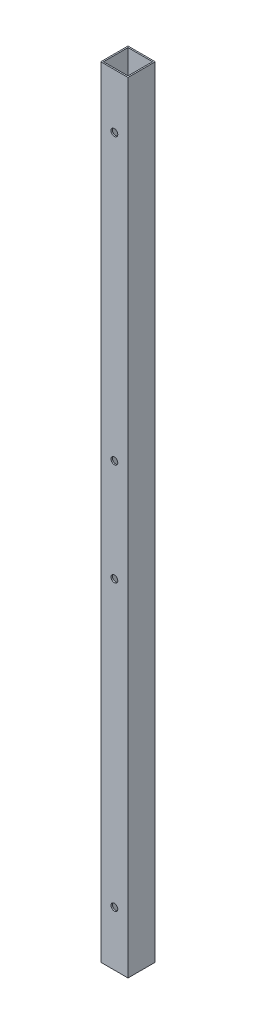
ISO-10303-21;
HEADER;
FILE_DESCRIPTION(('STEP AP214'),'2;1');
FILE_NAME('part.step','',(''),(''),'','','');
FILE_SCHEMA(('AUTOMOTIVE_DESIGN { 1 0 10303 214 1 1 1 1 }'));
ENDSEC;
DATA;
#1=APPLICATION_CONTEXT('core data for automotive mechanical design processes');
#2=APPLICATION_PROTOCOL_DEFINITION('international standard','automotive_design',2000,#1);
#3=PRODUCT_CONTEXT('',#1,'mechanical');
#4=PRODUCT('Part','Part','',(#3));
#5=PRODUCT_RELATED_PRODUCT_CATEGORY('part','',(#4));
#6=PRODUCT_DEFINITION_FORMATION('','',#4);
#7=PRODUCT_DEFINITION_CONTEXT('part definition',#1,'design');
#8=PRODUCT_DEFINITION('design','',#6,#7);
#9=PRODUCT_DEFINITION_SHAPE('','',#8);
#10=(LENGTH_UNIT() NAMED_UNIT(*) SI_UNIT(.MILLI.,.METRE.));
#11=(NAMED_UNIT(*) PLANE_ANGLE_UNIT() SI_UNIT($,.RADIAN.));
#12=(NAMED_UNIT(*) SI_UNIT($,.STERADIAN.) SOLID_ANGLE_UNIT());
#13=UNCERTAINTY_MEASURE_WITH_UNIT(LENGTH_MEASURE(1.E-05),#10,'distance_accuracy_value','');
#14=(GEOMETRIC_REPRESENTATION_CONTEXT(3) GLOBAL_UNCERTAINTY_ASSIGNED_CONTEXT((#13)) GLOBAL_UNIT_ASSIGNED_CONTEXT((#10,
#11,#12)) REPRESENTATION_CONTEXT('',''));
#15=CARTESIAN_POINT('',(0.,0.,0.));
#16=DIRECTION('',(0.,0.,1.));
#17=DIRECTION('',(1.,0.,0.));
#18=AXIS2_PLACEMENT_3D('',#15,#16,#17);
#19=CARTESIAN_POINT('',(0.,1454.15,0.));
#20=DIRECTION('',(0.,1.,0.));
#21=DIRECTION('',(0.,0.,1.));
#22=AXIS2_PLACEMENT_3D('',#19,#20,#21);
#23=PLANE('',#22);
#24=DIRECTION('',(0.,0.,-1.));
#25=VECTOR('',#24,1.);
#26=CARTESIAN_POINT('',(25.4,1454.15,-25.4));
#27=LINE('',#26,#25);
#28=CARTESIAN_POINT('',(25.4,1454.15,25.4));
#29=VERTEX_POINT('',#28);
#30=CARTESIAN_POINT('',(25.4,1454.15,-25.4));
#31=VERTEX_POINT('',#30);
#32=EDGE_CURVE('E163',#29,#31,#27,.T.);
#33=ORIENTED_EDGE('',*,*,#32,.T.);
#34=DIRECTION('',(-1.,0.,0.));
#35=VECTOR('',#34,1.);
#36=CARTESIAN_POINT('',(-25.4,1454.15,-25.4));
#37=LINE('',#36,#35);
#38=CARTESIAN_POINT('',(-25.4,1454.15,-25.4));
#39=VERTEX_POINT('',#38);
#40=EDGE_CURVE('E167',#31,#39,#37,.T.);
#41=ORIENTED_EDGE('',*,*,#40,.T.);
#42=DIRECTION('',(0.,0.,1.));
#43=VECTOR('',#42,1.);
#44=CARTESIAN_POINT('',(-25.4,1454.15,-25.4));
#45=LINE('',#44,#43);
#46=CARTESIAN_POINT('',(-25.4,1454.15,25.4));
#47=VERTEX_POINT('',#46);
#48=EDGE_CURVE('E171',#39,#47,#45,.T.);
#49=ORIENTED_EDGE('',*,*,#48,.T.);
#50=DIRECTION('',(1.,0.,0.));
#51=VECTOR('',#50,1.);
#52=CARTESIAN_POINT('',(-25.4,1454.15,25.4));
#53=LINE('',#52,#51);
#54=EDGE_CURVE('E174',#47,#29,#53,.T.);
#55=ORIENTED_EDGE('',*,*,#54,.T.);
#56=EDGE_LOOP('',(#33,#41,#49,#55));
#57=FACE_BOUND('',#56,.T.);
#58=DIRECTION('',(1.,0.,0.));
#59=VECTOR('',#58,1.);
#60=CARTESIAN_POINT('',(-22.86,1454.15,22.86));
#61=LINE('',#60,#59);
#62=CARTESIAN_POINT('',(-22.86,1454.15,22.86));
#63=VERTEX_POINT('',#62);
#64=CARTESIAN_POINT('',(22.86,1454.15,22.86));
#65=VERTEX_POINT('',#64);
#66=EDGE_CURVE('E121',#63,#65,#61,.T.);
#67=ORIENTED_EDGE('',*,*,#66,.F.);
#68=DIRECTION('',(0.,0.,1.));
#69=VECTOR('',#68,1.);
#70=CARTESIAN_POINT('',(-22.86,1454.15,-22.86));
#71=LINE('',#70,#69);
#72=CARTESIAN_POINT('',(-22.86,1454.15,-22.86));
#73=VERTEX_POINT('',#72);
#74=EDGE_CURVE('E112',#73,#63,#71,.T.);
#75=ORIENTED_EDGE('',*,*,#74,.F.);
#76=DIRECTION('',(-1.,0.,0.));
#77=VECTOR('',#76,1.);
#78=CARTESIAN_POINT('',(-22.86,1454.15,-22.86));
#79=LINE('',#78,#77);
#80=CARTESIAN_POINT('',(22.86,1454.15,-22.86));
#81=VERTEX_POINT('',#80);
#82=EDGE_CURVE('E139',#81,#73,#79,.T.);
#83=ORIENTED_EDGE('',*,*,#82,.F.);
#84=DIRECTION('',(0.,0.,-1.));
#85=VECTOR('',#84,1.);
#86=CARTESIAN_POINT('',(22.86,1454.15,-22.86));
#87=LINE('',#86,#85);
#88=EDGE_CURVE('E134',#65,#81,#87,.T.);
#89=ORIENTED_EDGE('',*,*,#88,.F.);
#90=EDGE_LOOP('',(#67,#75,#83,#89));
#91=FACE_BOUND('',#90,.T.);
#92=ADVANCED_FACE('F44',(#57,#91),#23,.T.);
#93=CARTESIAN_POINT('',(0.,0.,0.));
#94=DIRECTION('',(0.,1.,0.));
#95=DIRECTION('',(0.,0.,1.));
#96=AXIS2_PLACEMENT_3D('',#93,#94,#95);
#97=PLANE('',#96);
#98=DIRECTION('',(0.,0.,-1.));
#99=VECTOR('',#98,1.);
#100=CARTESIAN_POINT('',(25.4,0.,-25.4));
#101=LINE('',#100,#99);
#102=CARTESIAN_POINT('',(25.4,0.,25.4));
#103=VERTEX_POINT('',#102);
#104=CARTESIAN_POINT('',(25.4,0.,-25.4));
#105=VERTEX_POINT('',#104);
#106=EDGE_CURVE('E130',#103,#105,#101,.T.);
#107=ORIENTED_EDGE('',*,*,#106,.F.);
#108=DIRECTION('',(1.,0.,0.));
#109=VECTOR('',#108,1.);
#110=CARTESIAN_POINT('',(-25.4,0.,25.4));
#111=LINE('',#110,#109);
#112=CARTESIAN_POINT('',(-25.4,0.,25.4));
#113=VERTEX_POINT('',#112);
#114=EDGE_CURVE('E168',#113,#103,#111,.T.);
#115=ORIENTED_EDGE('',*,*,#114,.F.);
#116=DIRECTION('',(0.,0.,1.));
#117=VECTOR('',#116,1.);
#118=CARTESIAN_POINT('',(-25.4,0.,-25.4));
#119=LINE('',#118,#117);
#120=CARTESIAN_POINT('',(-25.4,0.,-25.4));
#121=VERTEX_POINT('',#120);
#122=EDGE_CURVE('E184',#121,#113,#119,.T.);
#123=ORIENTED_EDGE('',*,*,#122,.F.);
#124=DIRECTION('',(-1.,0.,0.));
#125=VECTOR('',#124,1.);
#126=CARTESIAN_POINT('',(-25.4,0.,-25.4));
#127=LINE('',#126,#125);
#128=EDGE_CURVE('E181',#105,#121,#127,.T.);
#129=ORIENTED_EDGE('',*,*,#128,.F.);
#130=EDGE_LOOP('',(#107,#115,#123,#129));
#131=FACE_BOUND('',#130,.T.);
#132=DIRECTION('',(0.,0.,1.));
#133=VECTOR('',#132,1.);
#134=CARTESIAN_POINT('',(-22.86,0.,-22.86));
#135=LINE('',#134,#133);
#136=CARTESIAN_POINT('',(-22.86,0.,-22.86));
#137=VERTEX_POINT('',#136);
#138=CARTESIAN_POINT('',(-22.86,0.,22.86));
#139=VERTEX_POINT('',#138);
#140=EDGE_CURVE('E70',#137,#139,#135,.T.);
#141=ORIENTED_EDGE('',*,*,#140,.T.);
#142=DIRECTION('',(1.,0.,0.));
#143=VECTOR('',#142,1.);
#144=CARTESIAN_POINT('',(-22.86,0.,22.86));
#145=LINE('',#144,#143);
#146=CARTESIAN_POINT('',(22.86,0.,22.86));
#147=VERTEX_POINT('',#146);
#148=EDGE_CURVE('E128',#139,#147,#145,.T.);
#149=ORIENTED_EDGE('',*,*,#148,.T.);
#150=DIRECTION('',(0.,0.,-1.));
#151=VECTOR('',#150,1.);
#152=CARTESIAN_POINT('',(22.86,0.,-22.86));
#153=LINE('',#152,#151);
#154=CARTESIAN_POINT('',(22.86,0.,-22.86));
#155=VERTEX_POINT('',#154);
#156=EDGE_CURVE('E150',#147,#155,#153,.T.);
#157=ORIENTED_EDGE('',*,*,#156,.T.);
#158=DIRECTION('',(-1.,0.,0.));
#159=VECTOR('',#158,1.);
#160=CARTESIAN_POINT('',(-22.86,0.,-22.86));
#161=LINE('',#160,#159);
#162=EDGE_CURVE('E122',#155,#137,#161,.T.);
#163=ORIENTED_EDGE('',*,*,#162,.T.);
#164=EDGE_LOOP('',(#141,#149,#157,#163));
#165=FACE_BOUND('',#164,.T.);
#166=ADVANCED_FACE('F265',(#131,#165),#97,.F.);
#167=CARTESIAN_POINT('',(25.4,1454.15,-25.4));
#168=DIRECTION('',(-1.,0.,0.));
#169=DIRECTION('',(0.,0.,1.));
#170=AXIS2_PLACEMENT_3D('',#167,#168,#169);
#171=PLANE('',#170);
#172=ORIENTED_EDGE('',*,*,#106,.T.);
#173=DIRECTION('',(0.,-1.,0.));
#174=VECTOR('',#173,1.);
#175=CARTESIAN_POINT('',(25.4,1454.15,-25.4));
#176=LINE('',#175,#174);
#177=EDGE_CURVE('E11',#31,#105,#176,.T.);
#178=ORIENTED_EDGE('',*,*,#177,.F.);
#179=ORIENTED_EDGE('',*,*,#32,.F.);
#180=DIRECTION('',(0.,-1.,0.));
#181=VECTOR('',#180,1.);
#182=CARTESIAN_POINT('',(25.4,1454.15,25.4));
#183=LINE('',#182,#181);
#184=EDGE_CURVE('E177',#29,#103,#183,.T.);
#185=ORIENTED_EDGE('',*,*,#184,.T.);
#186=EDGE_LOOP('',(#172,#178,#179,#185));
#187=FACE_BOUND('',#186,.T.);
#188=ADVANCED_FACE('F46',(#187),#171,.F.);
#189=CARTESIAN_POINT('',(-25.4,1454.15,-25.4));
#190=DIRECTION('',(0.,0.,1.));
#191=DIRECTION('',(1.,0.,0.));
#192=AXIS2_PLACEMENT_3D('',#189,#190,#191);
#193=PLANE('',#192);
#194=CARTESIAN_POINT('',(0.,822.325,-25.4));
#195=DIRECTION('',(0.,0.,1.));
#196=DIRECTION('',(1.,0.,0.));
#197=AXIS2_PLACEMENT_3D('',#194,#195,#196);
#198=CIRCLE('',#197,6.34999999999999);
#199=CARTESIAN_POINT('',(6.34999999999999,822.325,-25.4));
#200=VERTEX_POINT('',#199);
#201=EDGE_CURVE('E300',#200,#200,#198,.T.);
#202=ORIENTED_EDGE('',*,*,#201,.T.);
#203=EDGE_LOOP('',(#202));
#204=FACE_BOUND('',#203,.T.);
#205=CARTESIAN_POINT('',(0.,631.825,-25.4));
#206=DIRECTION('',(0.,0.,1.));
#207=DIRECTION('',(1.,0.,0.));
#208=AXIS2_PLACEMENT_3D('',#205,#206,#207);
#209=CIRCLE('',#208,6.34999999999999);
#210=CARTESIAN_POINT('',(6.34999999999999,631.825,-25.4));
#211=VERTEX_POINT('',#210);
#212=EDGE_CURVE('E213',#211,#211,#209,.T.);
#213=ORIENTED_EDGE('',*,*,#212,.T.);
#214=EDGE_LOOP('',(#213));
#215=FACE_BOUND('',#214,.T.);
#216=CARTESIAN_POINT('',(0.,1352.55,-25.4));
#217=DIRECTION('',(0.,0.,1.));
#218=DIRECTION('',(1.,0.,0.));
#219=AXIS2_PLACEMENT_3D('',#216,#217,#218);
#220=CIRCLE('',#219,6.34999999999999);
#221=CARTESIAN_POINT('',(6.34999999999999,1352.55,-25.4));
#222=VERTEX_POINT('',#221);
#223=EDGE_CURVE('E208',#222,#222,#220,.T.);
#224=ORIENTED_EDGE('',*,*,#223,.T.);
#225=EDGE_LOOP('',(#224));
#226=FACE_BOUND('',#225,.T.);
#227=CARTESIAN_POINT('',(0.,101.6,-25.4));
#228=DIRECTION('',(0.,0.,1.));
#229=DIRECTION('',(1.,0.,0.));
#230=AXIS2_PLACEMENT_3D('',#227,#228,#229);
#231=CIRCLE('',#230,6.34999999999999);
#232=CARTESIAN_POINT('',(6.34999999999999,101.6,-25.4));
#233=VERTEX_POINT('',#232);
#234=EDGE_CURVE('E203',#233,#233,#231,.T.);
#235=ORIENTED_EDGE('',*,*,#234,.T.);
#236=EDGE_LOOP('',(#235));
#237=FACE_BOUND('',#236,.T.);
#238=ORIENTED_EDGE('',*,*,#128,.T.);
#239=DIRECTION('',(0.,-1.,0.));
#240=VECTOR('',#239,1.);
#241=CARTESIAN_POINT('',(-25.4,1454.15,-25.4));
#242=LINE('',#241,#240);
#243=EDGE_CURVE('E54',#39,#121,#242,.T.);
#244=ORIENTED_EDGE('',*,*,#243,.F.);
#245=ORIENTED_EDGE('',*,*,#40,.F.);
#246=ORIENTED_EDGE('',*,*,#177,.T.);
#247=EDGE_LOOP('',(#238,#244,#245,#246));
#248=FACE_BOUND('',#247,.T.);
#249=ADVANCED_FACE('F290',(#204,#215,#226,#237,#248),#193,.F.);
#250=CARTESIAN_POINT('',(-25.4,1454.15,-25.4));
#251=DIRECTION('',(1.,0.,0.));
#252=DIRECTION('',(0.,0.,-1.));
#253=AXIS2_PLACEMENT_3D('',#250,#251,#252);
#254=PLANE('',#253);
#255=ORIENTED_EDGE('',*,*,#122,.T.);
#256=DIRECTION('',(0.,-1.,0.));
#257=VECTOR('',#256,1.);
#258=CARTESIAN_POINT('',(-25.4,1454.15,25.4));
#259=LINE('',#258,#257);
#260=EDGE_CURVE('E192',#47,#113,#259,.T.);
#261=ORIENTED_EDGE('',*,*,#260,.F.);
#262=ORIENTED_EDGE('',*,*,#48,.F.);
#263=ORIENTED_EDGE('',*,*,#243,.T.);
#264=EDGE_LOOP('',(#255,#261,#262,#263));
#265=FACE_BOUND('',#264,.T.);
#266=ADVANCED_FACE('F287',(#265),#254,.F.);
#267=CARTESIAN_POINT('',(-25.4,1454.15,25.4));
#268=DIRECTION('',(0.,0.,-1.));
#269=DIRECTION('',(-1.,0.,0.));
#270=AXIS2_PLACEMENT_3D('',#267,#268,#269);
#271=PLANE('',#270);
#272=CARTESIAN_POINT('',(0.,822.325,25.4));
#273=DIRECTION('',(0.,0.,1.));
#274=DIRECTION('',(1.,0.,0.));
#275=AXIS2_PLACEMENT_3D('',#272,#273,#274);
#276=CIRCLE('',#275,6.35);
#277=CARTESIAN_POINT('',(6.35,822.325,25.4));
#278=VERTEX_POINT('',#277);
#279=EDGE_CURVE('E347',#278,#278,#276,.T.);
#280=ORIENTED_EDGE('',*,*,#279,.F.);
#281=EDGE_LOOP('',(#280));
#282=FACE_BOUND('',#281,.T.);
#283=CARTESIAN_POINT('',(0.,631.825,25.4));
#284=DIRECTION('',(0.,0.,1.));
#285=DIRECTION('',(1.,0.,0.));
#286=AXIS2_PLACEMENT_3D('',#283,#284,#285);
#287=CIRCLE('',#286,6.35);
#288=CARTESIAN_POINT('',(6.35,631.825,25.4));
#289=VERTEX_POINT('',#288);
#290=EDGE_CURVE('E223',#289,#289,#287,.T.);
#291=ORIENTED_EDGE('',*,*,#290,.F.);
#292=EDGE_LOOP('',(#291));
#293=FACE_BOUND('',#292,.T.);
#294=CARTESIAN_POINT('',(0.,1352.55,25.4));
#295=DIRECTION('',(0.,0.,1.));
#296=DIRECTION('',(1.,0.,0.));
#297=AXIS2_PLACEMENT_3D('',#294,#295,#296);
#298=CIRCLE('',#297,6.34999999999999);
#299=CARTESIAN_POINT('',(6.34999999999999,1352.55,25.4));
#300=VERTEX_POINT('',#299);
#301=EDGE_CURVE('E220',#300,#300,#298,.T.);
#302=ORIENTED_EDGE('',*,*,#301,.F.);
#303=EDGE_LOOP('',(#302));
#304=FACE_BOUND('',#303,.T.);
#305=CARTESIAN_POINT('',(0.,101.6,25.4));
#306=DIRECTION('',(0.,0.,1.));
#307=DIRECTION('',(1.,0.,0.));
#308=AXIS2_PLACEMENT_3D('',#305,#306,#307);
#309=CIRCLE('',#308,6.34999999999999);
#310=CARTESIAN_POINT('',(6.34999999999999,101.6,25.4));
#311=VERTEX_POINT('',#310);
#312=EDGE_CURVE('E243',#311,#311,#309,.T.);
#313=ORIENTED_EDGE('',*,*,#312,.F.);
#314=EDGE_LOOP('',(#313));
#315=FACE_BOUND('',#314,.T.);
#316=ORIENTED_EDGE('',*,*,#114,.T.);
#317=ORIENTED_EDGE('',*,*,#184,.F.);
#318=ORIENTED_EDGE('',*,*,#54,.F.);
#319=ORIENTED_EDGE('',*,*,#260,.T.);
#320=EDGE_LOOP('',(#316,#317,#318,#319));
#321=FACE_BOUND('',#320,.T.);
#322=ADVANCED_FACE('F284',(#282,#293,#304,#315,#321),#271,.F.);
#323=CARTESIAN_POINT('',(-22.86,1454.15,-22.86));
#324=DIRECTION('',(1.,0.,0.));
#325=DIRECTION('',(0.,0.,-1.));
#326=AXIS2_PLACEMENT_3D('',#323,#324,#325);
#327=PLANE('',#326);
#328=ORIENTED_EDGE('',*,*,#140,.F.);
#329=DIRECTION('',(0.,-1.,0.));
#330=VECTOR('',#329,1.);
#331=CARTESIAN_POINT('',(-22.86,1454.15,-22.86));
#332=LINE('',#331,#330);
#333=EDGE_CURVE('E116',#73,#137,#332,.T.);
#334=ORIENTED_EDGE('',*,*,#333,.F.);
#335=ORIENTED_EDGE('',*,*,#74,.T.);
#336=DIRECTION('',(0.,-1.,0.));
#337=VECTOR('',#336,1.);
#338=CARTESIAN_POINT('',(-22.86,1454.15,22.86));
#339=LINE('',#338,#337);
#340=EDGE_CURVE('E115',#63,#139,#339,.T.);
#341=ORIENTED_EDGE('',*,*,#340,.T.);
#342=EDGE_LOOP('',(#328,#334,#335,#341));
#343=FACE_BOUND('',#342,.T.);
#344=ADVANCED_FACE('F114',(#343),#327,.T.);
#345=CARTESIAN_POINT('',(-22.86,1454.15,22.86));
#346=DIRECTION('',(0.,0.,-1.));
#347=DIRECTION('',(-1.,0.,0.));
#348=AXIS2_PLACEMENT_3D('',#345,#346,#347);
#349=PLANE('',#348);
#350=CARTESIAN_POINT('',(0.,822.325,22.86));
#351=DIRECTION('',(0.,0.,-1.));
#352=DIRECTION('',(-1.,0.,0.));
#353=AXIS2_PLACEMENT_3D('',#350,#351,#352);
#354=CIRCLE('',#353,6.35);
#355=CARTESIAN_POINT('',(-6.35,822.325,22.86));
#356=VERTEX_POINT('',#355);
#357=EDGE_CURVE('E230',#356,#356,#354,.T.);
#358=ORIENTED_EDGE('',*,*,#357,.F.);
#359=EDGE_LOOP('',(#358));
#360=FACE_BOUND('',#359,.T.);
#361=CARTESIAN_POINT('',(0.,631.825,22.86));
#362=DIRECTION('',(0.,0.,-1.));
#363=DIRECTION('',(-1.,0.,0.));
#364=AXIS2_PLACEMENT_3D('',#361,#362,#363);
#365=CIRCLE('',#364,6.35);
#366=CARTESIAN_POINT('',(-6.35,631.825,22.86));
#367=VERTEX_POINT('',#366);
#368=EDGE_CURVE('E209',#367,#367,#365,.T.);
#369=ORIENTED_EDGE('',*,*,#368,.F.);
#370=EDGE_LOOP('',(#369));
#371=FACE_BOUND('',#370,.T.);
#372=CARTESIAN_POINT('',(0.,1352.55,22.86));
#373=DIRECTION('',(0.,0.,-1.));
#374=DIRECTION('',(-1.,0.,0.));
#375=AXIS2_PLACEMENT_3D('',#372,#373,#374);
#376=CIRCLE('',#375,6.34999999999999);
#377=CARTESIAN_POINT('',(-6.34999999999999,1352.55,22.86));
#378=VERTEX_POINT('',#377);
#379=EDGE_CURVE('E207',#378,#378,#376,.T.);
#380=ORIENTED_EDGE('',*,*,#379,.F.);
#381=EDGE_LOOP('',(#380));
#382=FACE_BOUND('',#381,.T.);
#383=CARTESIAN_POINT('',(0.,101.6,22.86));
#384=DIRECTION('',(0.,0.,-1.));
#385=DIRECTION('',(-1.,0.,0.));
#386=AXIS2_PLACEMENT_3D('',#383,#384,#385);
#387=CIRCLE('',#386,6.34999999999999);
#388=CARTESIAN_POINT('',(-6.34999999999999,101.6,22.86));
#389=VERTEX_POINT('',#388);
#390=EDGE_CURVE('E199',#389,#389,#387,.T.);
#391=ORIENTED_EDGE('',*,*,#390,.F.);
#392=EDGE_LOOP('',(#391));
#393=FACE_BOUND('',#392,.T.);
#394=ORIENTED_EDGE('',*,*,#148,.F.);
#395=ORIENTED_EDGE('',*,*,#340,.F.);
#396=ORIENTED_EDGE('',*,*,#66,.T.);
#397=DIRECTION('',(0.,-1.,0.));
#398=VECTOR('',#397,1.);
#399=CARTESIAN_POINT('',(22.86,1454.15,22.86));
#400=LINE('',#399,#398);
#401=EDGE_CURVE('E131',#65,#147,#400,.T.);
#402=ORIENTED_EDGE('',*,*,#401,.T.);
#403=EDGE_LOOP('',(#394,#395,#396,#402));
#404=FACE_BOUND('',#403,.T.);
#405=ADVANCED_FACE('F125',(#360,#371,#382,#393,#404),#349,.T.);
#406=CARTESIAN_POINT('',(22.86,1454.15,-22.86));
#407=DIRECTION('',(-1.,0.,0.));
#408=DIRECTION('',(0.,0.,1.));
#409=AXIS2_PLACEMENT_3D('',#406,#407,#408);
#410=PLANE('',#409);
#411=ORIENTED_EDGE('',*,*,#156,.F.);
#412=ORIENTED_EDGE('',*,*,#401,.F.);
#413=ORIENTED_EDGE('',*,*,#88,.T.);
#414=DIRECTION('',(0.,-1.,0.));
#415=VECTOR('',#414,1.);
#416=CARTESIAN_POINT('',(22.86,1454.15,-22.86));
#417=LINE('',#416,#415);
#418=EDGE_CURVE('E62',#81,#155,#417,.T.);
#419=ORIENTED_EDGE('',*,*,#418,.T.);
#420=EDGE_LOOP('',(#411,#412,#413,#419));
#421=FACE_BOUND('',#420,.T.);
#422=ADVANCED_FACE('F260',(#421),#410,.T.);
#423=CARTESIAN_POINT('',(-22.86,1454.15,-22.86));
#424=DIRECTION('',(0.,0.,1.));
#425=DIRECTION('',(1.,0.,0.));
#426=AXIS2_PLACEMENT_3D('',#423,#424,#425);
#427=PLANE('',#426);
#428=CARTESIAN_POINT('',(0.,822.325,-22.86));
#429=DIRECTION('',(0.,0.,1.));
#430=DIRECTION('',(1.,0.,0.));
#431=AXIS2_PLACEMENT_3D('',#428,#429,#430);
#432=CIRCLE('',#431,6.35);
#433=CARTESIAN_POINT('',(6.35,822.325,-22.86));
#434=VERTEX_POINT('',#433);
#435=EDGE_CURVE('E48',#434,#434,#432,.T.);
#436=ORIENTED_EDGE('',*,*,#435,.F.);
#437=EDGE_LOOP('',(#436));
#438=FACE_BOUND('',#437,.T.);
#439=CARTESIAN_POINT('',(0.,631.825,-22.86));
#440=DIRECTION('',(0.,0.,1.));
#441=DIRECTION('',(1.,0.,0.));
#442=AXIS2_PLACEMENT_3D('',#439,#440,#441);
#443=CIRCLE('',#442,6.35);
#444=CARTESIAN_POINT('',(6.35,631.825,-22.86));
#445=VERTEX_POINT('',#444);
#446=EDGE_CURVE('E212',#445,#445,#443,.T.);
#447=ORIENTED_EDGE('',*,*,#446,.F.);
#448=EDGE_LOOP('',(#447));
#449=FACE_BOUND('',#448,.T.);
#450=CARTESIAN_POINT('',(0.,1352.55,-22.86));
#451=DIRECTION('',(0.,0.,1.));
#452=DIRECTION('',(1.,0.,0.));
#453=AXIS2_PLACEMENT_3D('',#450,#451,#452);
#454=CIRCLE('',#453,6.34999999999999);
#455=CARTESIAN_POINT('',(6.34999999999999,1352.55,-22.86));
#456=VERTEX_POINT('',#455);
#457=EDGE_CURVE('E204',#456,#456,#454,.T.);
#458=ORIENTED_EDGE('',*,*,#457,.F.);
#459=EDGE_LOOP('',(#458));
#460=FACE_BOUND('',#459,.T.);
#461=CARTESIAN_POINT('',(0.,101.6,-22.86));
#462=DIRECTION('',(0.,0.,1.));
#463=DIRECTION('',(1.,0.,0.));
#464=AXIS2_PLACEMENT_3D('',#461,#462,#463);
#465=CIRCLE('',#464,6.34999999999999);
#466=CARTESIAN_POINT('',(6.34999999999999,101.6,-22.86));
#467=VERTEX_POINT('',#466);
#468=EDGE_CURVE('E147',#467,#467,#465,.T.);
#469=ORIENTED_EDGE('',*,*,#468,.F.);
#470=EDGE_LOOP('',(#469));
#471=FACE_BOUND('',#470,.T.);
#472=ORIENTED_EDGE('',*,*,#162,.F.);
#473=ORIENTED_EDGE('',*,*,#418,.F.);
#474=ORIENTED_EDGE('',*,*,#82,.T.);
#475=ORIENTED_EDGE('',*,*,#333,.T.);
#476=EDGE_LOOP('',(#472,#473,#474,#475));
#477=FACE_BOUND('',#476,.T.);
#478=ADVANCED_FACE('F257',(#438,#449,#460,#471,#477),#427,.T.);
#479=CARTESIAN_POINT('',(0.,101.6,25.4));
#480=DIRECTION('',(0.,0.,1.));
#481=DIRECTION('',(1.,0.,0.));
#482=AXIS2_PLACEMENT_3D('',#479,#480,#481);
#483=CYLINDRICAL_SURFACE('',#482,6.34999999999999);
#484=ORIENTED_EDGE('',*,*,#390,.T.);
#485=EDGE_LOOP('',(#484));
#486=FACE_BOUND('',#485,.T.);
#487=ORIENTED_EDGE('',*,*,#312,.T.);
#488=EDGE_LOOP('',(#487));
#489=FACE_BOUND('',#488,.T.);
#490=ADVANCED_FACE('F259',(#486,#489),#483,.F.);
#491=ORIENTED_EDGE('',*,*,#468,.T.);
#492=EDGE_LOOP('',(#491));
#493=FACE_BOUND('',#492,.T.);
#494=ORIENTED_EDGE('',*,*,#234,.F.);
#495=EDGE_LOOP('',(#494));
#496=FACE_BOUND('',#495,.T.);
#497=ADVANCED_FACE('F254',(#493,#496),#483,.F.);
#498=CARTESIAN_POINT('',(0.,1352.55,25.4));
#499=DIRECTION('',(0.,0.,1.));
#500=DIRECTION('',(1.,0.,0.));
#501=AXIS2_PLACEMENT_3D('',#498,#499,#500);
#502=CYLINDRICAL_SURFACE('',#501,6.34999999999999);
#503=ORIENTED_EDGE('',*,*,#457,.T.);
#504=EDGE_LOOP('',(#503));
#505=FACE_BOUND('',#504,.T.);
#506=ORIENTED_EDGE('',*,*,#223,.F.);
#507=EDGE_LOOP('',(#506));
#508=FACE_BOUND('',#507,.T.);
#509=ADVANCED_FACE('F318',(#505,#508),#502,.F.);
#510=ORIENTED_EDGE('',*,*,#379,.T.);
#511=EDGE_LOOP('',(#510));
#512=FACE_BOUND('',#511,.T.);
#513=ORIENTED_EDGE('',*,*,#301,.T.);
#514=EDGE_LOOP('',(#513));
#515=FACE_BOUND('',#514,.T.);
#516=ADVANCED_FACE('F324',(#512,#515),#502,.F.);
#517=CARTESIAN_POINT('',(0.,631.825,25.4));
#518=DIRECTION('',(0.,0.,1.));
#519=DIRECTION('',(1.,0.,0.));
#520=AXIS2_PLACEMENT_3D('',#517,#518,#519);
#521=CYLINDRICAL_SURFACE('',#520,6.35);
#522=ORIENTED_EDGE('',*,*,#368,.T.);
#523=EDGE_LOOP('',(#522));
#524=FACE_BOUND('',#523,.T.);
#525=ORIENTED_EDGE('',*,*,#290,.T.);
#526=EDGE_LOOP('',(#525));
#527=FACE_BOUND('',#526,.T.);
#528=ADVANCED_FACE('F329',(#524,#527),#521,.F.);
#529=ORIENTED_EDGE('',*,*,#446,.T.);
#530=EDGE_LOOP('',(#529));
#531=FACE_BOUND('',#530,.T.);
#532=ORIENTED_EDGE('',*,*,#212,.F.);
#533=EDGE_LOOP('',(#532));
#534=FACE_BOUND('',#533,.T.);
#535=ADVANCED_FACE('F332',(#531,#534),#521,.F.);
#536=CARTESIAN_POINT('',(0.,822.325,25.4));
#537=DIRECTION('',(0.,0.,1.));
#538=DIRECTION('',(1.,0.,0.));
#539=AXIS2_PLACEMENT_3D('',#536,#537,#538);
#540=CYLINDRICAL_SURFACE('',#539,6.35);
#541=ORIENTED_EDGE('',*,*,#435,.T.);
#542=EDGE_LOOP('',(#541));
#543=FACE_BOUND('',#542,.T.);
#544=ORIENTED_EDGE('',*,*,#201,.F.);
#545=EDGE_LOOP('',(#544));
#546=FACE_BOUND('',#545,.T.);
#547=ADVANCED_FACE('F333',(#543,#546),#540,.F.);
#548=ORIENTED_EDGE('',*,*,#357,.T.);
#549=EDGE_LOOP('',(#548));
#550=FACE_BOUND('',#549,.T.);
#551=ORIENTED_EDGE('',*,*,#279,.T.);
#552=EDGE_LOOP('',(#551));
#553=FACE_BOUND('',#552,.T.);
#554=ADVANCED_FACE('F335',(#550,#553),#540,.F.);
#555=CLOSED_SHELL('',(#92,#166,#188,#249,#266,#322,#344,#405,#422,#478,#490,#497,#509,#516,#528,
#535,#547,#554));
#556=MANIFOLD_SOLID_BREP('B2',#555);
#557=ADVANCED_BREP_SHAPE_REPRESENTATION('',(#18,#556),#14);
#558=SHAPE_DEFINITION_REPRESENTATION(#9,#557);
ENDSEC;
END-ISO-10303-21;
